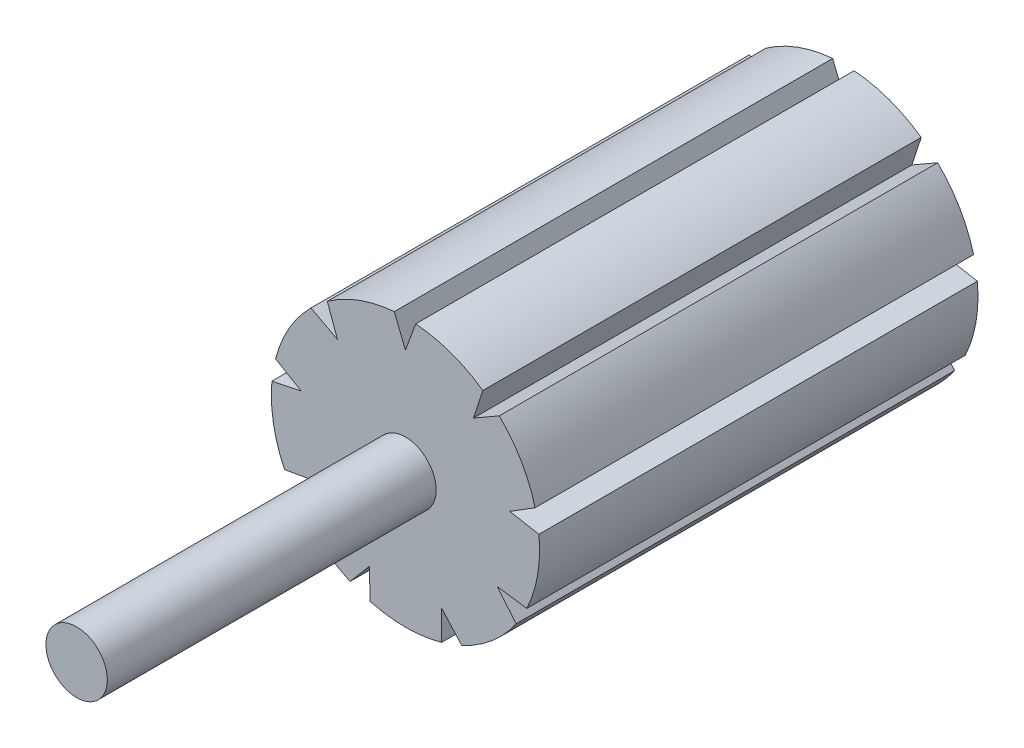
ISO-10303-21;
HEADER;
FILE_DESCRIPTION(('STEP AP214'),'2;1');
FILE_NAME('part.step','',(''),(''),'','','');
FILE_SCHEMA(('AUTOMOTIVE_DESIGN { 1 0 10303 214 1 1 1 1 }'));
ENDSEC;
DATA;
#1=APPLICATION_CONTEXT('core data for automotive mechanical design processes');
#2=APPLICATION_PROTOCOL_DEFINITION('international standard','automotive_design',2000,#1);
#3=PRODUCT_CONTEXT('',#1,'mechanical');
#4=PRODUCT('Part','Part','',(#3));
#5=PRODUCT_RELATED_PRODUCT_CATEGORY('part','',(#4));
#6=PRODUCT_DEFINITION_FORMATION('','',#4);
#7=PRODUCT_DEFINITION_CONTEXT('part definition',#1,'design');
#8=PRODUCT_DEFINITION('design','',#6,#7);
#9=PRODUCT_DEFINITION_SHAPE('','',#8);
#10=(LENGTH_UNIT() NAMED_UNIT(*) SI_UNIT(.MILLI.,.METRE.));
#11=(NAMED_UNIT(*) PLANE_ANGLE_UNIT() SI_UNIT($,.RADIAN.));
#12=(NAMED_UNIT(*) SI_UNIT($,.STERADIAN.) SOLID_ANGLE_UNIT());
#13=UNCERTAINTY_MEASURE_WITH_UNIT(LENGTH_MEASURE(1.E-05),#10,'distance_accuracy_value','');
#14=(GEOMETRIC_REPRESENTATION_CONTEXT(3) GLOBAL_UNCERTAINTY_ASSIGNED_CONTEXT((#13)) GLOBAL_UNIT_ASSIGNED_CONTEXT((#10,
#11,#12)) REPRESENTATION_CONTEXT('',''));
#15=CARTESIAN_POINT('',(0.,0.,0.));
#16=DIRECTION('',(0.,0.,1.));
#17=DIRECTION('',(1.,0.,0.));
#18=AXIS2_PLACEMENT_3D('',#15,#16,#17);
#19=CARTESIAN_POINT('',(-0.510008870233366,6.09753795689209,20.));
#20=DIRECTION('',(-0.928039759605838,-0.372481146624549,0.));
#21=DIRECTION('',(0.372481146624549,-0.928039759605838,0.));
#22=AXIS2_PLACEMENT_3D('',#19,#20,#21);
#23=PLANE('',#22);
#24=DIRECTION('',(-0.372481146624549,0.928039759605838,0.));
#25=VECTOR('',#24,1.);
#26=CARTESIAN_POINT('',(-0.510008870233366,6.09753795689209,0.));
#27=LINE('',#26,#25);
#28=CARTESIAN_POINT('',(0.,4.82684677260722,0.));
#29=VERTEX_POINT('',#28);
#30=CARTESIAN_POINT('',(-0.510008870233366,6.09753795689209,0.));
#31=VERTEX_POINT('',#30);
#32=EDGE_CURVE('E254',#29,#31,#27,.T.);
#33=ORIENTED_EDGE('',*,*,#32,.T.);
#34=DIRECTION('',(0.,0.,-1.));
#35=VECTOR('',#34,1.);
#36=CARTESIAN_POINT('',(-0.510008870233366,6.09753795689209,20.));
#37=LINE('',#36,#35);
#38=CARTESIAN_POINT('',(-0.510008870233366,6.09753795689209,20.));
#39=VERTEX_POINT('',#38);
#40=EDGE_CURVE('E11',#39,#31,#37,.T.);
#41=ORIENTED_EDGE('',*,*,#40,.F.);
#42=DIRECTION('',(-0.372481146624549,0.928039759605838,0.));
#43=VECTOR('',#42,1.);
#44=CARTESIAN_POINT('',(-0.510008870233366,6.09753795689209,20.));
#45=LINE('',#44,#43);
#46=CARTESIAN_POINT('',(0.,4.82684677260722,20.));
#47=VERTEX_POINT('',#46);
#48=EDGE_CURVE('E334',#47,#39,#45,.T.);
#49=ORIENTED_EDGE('',*,*,#48,.F.);
#50=DIRECTION('',(0.,0.,-1.));
#51=VECTOR('',#50,1.);
#52=CARTESIAN_POINT('',(0.,4.82684677260722,20.));
#53=LINE('',#52,#51);
#54=EDGE_CURVE('E250',#47,#29,#53,.T.);
#55=ORIENTED_EDGE('',*,*,#54,.T.);
#56=EDGE_LOOP('',(#33,#41,#49,#55));
#57=FACE_BOUND('',#56,.T.);
#58=ADVANCED_FACE('F39',(#57),#23,.F.);
#59=CARTESIAN_POINT('',(0.,0.,20.));
#60=DIRECTION('',(0.,0.,-1.));
#61=DIRECTION('',(-1.,0.,0.));
#62=AXIS2_PLACEMENT_3D('',#59,#60,#61);
#63=CYLINDRICAL_SURFACE('',#62,6.11882980507355);
#64=CARTESIAN_POINT('',(0.,0.,0.));
#65=DIRECTION('',(0.,0.,1.));
#66=DIRECTION('',(1.,0.,0.));
#67=AXIS2_PLACEMENT_3D('',#64,#65,#66);
#68=CIRCLE('',#67,6.11882980507355);
#69=CARTESIAN_POINT('',(-3.56361986297676,4.97400157374864,0.));
#70=VERTEX_POINT('',#69);
#71=EDGE_CURVE('E258',#31,#70,#68,.T.);
#72=ORIENTED_EDGE('',*,*,#71,.T.);
#73=DIRECTION('',(0.,0.,-1.));
#74=VECTOR('',#73,1.);
#75=CARTESIAN_POINT('',(-3.56361986297676,4.97400157374864,20.));
#76=LINE('',#75,#74);
#77=CARTESIAN_POINT('',(-3.56361986297676,4.97400157374864,20.));
#78=VERTEX_POINT('',#77);
#79=EDGE_CURVE('E48',#78,#70,#76,.T.);
#80=ORIENTED_EDGE('',*,*,#79,.F.);
#81=CARTESIAN_POINT('',(0.,0.,20.));
#82=DIRECTION('',(0.,0.,1.));
#83=DIRECTION('',(1.,0.,0.));
#84=AXIS2_PLACEMENT_3D('',#81,#82,#83);
#85=CIRCLE('',#84,6.11882980507355);
#86=EDGE_CURVE('E156',#39,#78,#85,.T.);
#87=ORIENTED_EDGE('',*,*,#86,.F.);
#88=ORIENTED_EDGE('',*,*,#40,.T.);
#89=EDGE_LOOP('',(#72,#80,#87,#88));
#90=FACE_BOUND('',#89,.T.);
#91=ADVANCED_FACE('F534',(#90),#63,.T.);
#92=CARTESIAN_POINT('',(-3.10263729928743,3.69757914794242,20.));
#93=DIRECTION('',(0.940541601426666,0.33967851858156,0.));
#94=DIRECTION('',(-0.33967851858156,0.940541601426666,0.));
#95=AXIS2_PLACEMENT_3D('',#92,#93,#94);
#96=PLANE('',#95);
#97=DIRECTION('',(0.33967851858156,-0.940541601426666,0.));
#98=VECTOR('',#97,1.);
#99=CARTESIAN_POINT('',(-3.10263729928743,3.69757914794242,0.));
#100=LINE('',#99,#98);
#101=CARTESIAN_POINT('',(-3.10263729928743,3.69757914794242,0.));
#102=VERTEX_POINT('',#101);
#103=EDGE_CURVE('E262',#70,#102,#100,.T.);
#104=ORIENTED_EDGE('',*,*,#103,.T.);
#105=DIRECTION('',(0.,0.,-1.));
#106=VECTOR('',#105,1.);
#107=CARTESIAN_POINT('',(-3.10263729928743,3.69757914794242,20.));
#108=LINE('',#107,#106);
#109=CARTESIAN_POINT('',(-3.10263729928743,3.69757914794242,20.));
#110=VERTEX_POINT('',#109);
#111=EDGE_CURVE('E421',#110,#102,#108,.T.);
#112=ORIENTED_EDGE('',*,*,#111,.F.);
#113=DIRECTION('',(0.33967851858156,-0.940541601426666,0.));
#114=VECTOR('',#113,1.);
#115=CARTESIAN_POINT('',(-3.10263729928743,3.69757914794242,20.));
#116=LINE('',#115,#114);
#117=EDGE_CURVE('E431',#78,#110,#116,.T.);
#118=ORIENTED_EDGE('',*,*,#117,.F.);
#119=ORIENTED_EDGE('',*,*,#79,.T.);
#120=EDGE_LOOP('',(#104,#112,#118,#119));
#121=FACE_BOUND('',#120,.T.);
#122=ADVANCED_FACE('F429',(#121),#96,.F.);
#123=CARTESIAN_POINT('',(-4.31011130926722,4.34315768596786,20.));
#124=DIRECTION('',(-0.47149343494739,-0.881869571309449,0.));
#125=DIRECTION('',(0.881869571309449,-0.47149343494739,0.));
#126=AXIS2_PLACEMENT_3D('',#123,#124,#125);
#127=PLANE('',#126);
#128=DIRECTION('',(-0.881869571309449,0.47149343494739,0.));
#129=VECTOR('',#128,1.);
#130=CARTESIAN_POINT('',(-4.31011130926722,4.34315768596786,0.));
#131=LINE('',#130,#129);
#132=CARTESIAN_POINT('',(-4.31011130926727,4.3431576859679,0.));
#133=VERTEX_POINT('',#132);
#134=EDGE_CURVE('E265',#102,#133,#131,.T.);
#135=ORIENTED_EDGE('',*,*,#134,.T.);
#136=DIRECTION('',(0.,0.,-1.));
#137=VECTOR('',#136,1.);
#138=CARTESIAN_POINT('',(-4.31011130926727,4.3431576859679,20.));
#139=LINE('',#138,#137);
#140=CARTESIAN_POINT('',(-4.31011130926727,4.3431576859679,20.));
#141=VERTEX_POINT('',#140);
#142=EDGE_CURVE('E417',#141,#133,#139,.T.);
#143=ORIENTED_EDGE('',*,*,#142,.F.);
#144=DIRECTION('',(-0.881869571309449,0.47149343494739,0.));
#145=VECTOR('',#144,1.);
#146=CARTESIAN_POINT('',(-4.31011130926722,4.34315768596786,20.));
#147=LINE('',#146,#145);
#148=EDGE_CURVE('E450',#110,#141,#147,.T.);
#149=ORIENTED_EDGE('',*,*,#148,.F.);
#150=ORIENTED_EDGE('',*,*,#111,.T.);
#151=EDGE_LOOP('',(#135,#143,#149,#150));
#152=FACE_BOUND('',#151,.T.);
#153=ADVANCED_FACE('F440',(#152),#127,.F.);
#154=CARTESIAN_POINT('',(0.,0.,20.));
#155=DIRECTION('',(0.,0.,-1.));
#156=DIRECTION('',(-1.,0.,0.));
#157=AXIS2_PLACEMENT_3D('',#154,#155,#156);
#158=CYLINDRICAL_SURFACE('',#157,6.11882980507349);
#159=CARTESIAN_POINT('',(0.,0.,0.));
#160=DIRECTION('',(0.,0.,1.));
#161=DIRECTION('',(1.,0.,0.));
#162=AXIS2_PLACEMENT_3D('',#159,#160,#161);
#163=CIRCLE('',#162,6.11882980507349);
#164=CARTESIAN_POINT('',(-5.92711777558873,1.51965557208089,0.));
#165=VERTEX_POINT('',#164);
#166=EDGE_CURVE('E268',#133,#165,#163,.T.);
#167=ORIENTED_EDGE('',*,*,#166,.T.);
#168=DIRECTION('',(0.,0.,-1.));
#169=VECTOR('',#168,1.);
#170=CARTESIAN_POINT('',(-5.92711777558873,1.51965557208089,20.));
#171=LINE('',#170,#169);
#172=CARTESIAN_POINT('',(-5.92711777558873,1.51965557208089,20.));
#173=VERTEX_POINT('',#172);
#174=EDGE_CURVE('E413',#173,#165,#171,.T.);
#175=ORIENTED_EDGE('',*,*,#174,.F.);
#176=CARTESIAN_POINT('',(0.,0.,20.));
#177=DIRECTION('',(0.,0.,1.));
#178=DIRECTION('',(1.,0.,0.));
#179=AXIS2_PLACEMENT_3D('',#176,#177,#178);
#180=CIRCLE('',#179,6.11882980507349);
#181=EDGE_CURVE('E446',#141,#173,#180,.T.);
#182=ORIENTED_EDGE('',*,*,#181,.F.);
#183=ORIENTED_EDGE('',*,*,#142,.T.);
#184=EDGE_LOOP('',(#167,#175,#182,#183));
#185=FACE_BOUND('',#184,.T.);
#186=ADVANCED_FACE('F444',(#185),#158,.T.);
#187=CARTESIAN_POINT('',(-4.75351612426556,0.838173145940657,20.));
#188=DIRECTION('',(0.502155524274218,0.864777329398086,0.));
#189=DIRECTION('',(-0.864777329398086,0.502155524274218,0.));
#190=AXIS2_PLACEMENT_3D('',#187,#188,#189);
#191=PLANE('',#190);
#192=DIRECTION('',(0.864777329398086,-0.502155524274218,0.));
#193=VECTOR('',#192,1.);
#194=CARTESIAN_POINT('',(-4.75351612426556,0.838173145940657,0.));
#195=LINE('',#194,#193);
#196=CARTESIAN_POINT('',(-4.75351612426556,0.838173145940657,0.));
#197=VERTEX_POINT('',#196);
#198=EDGE_CURVE('E271',#165,#197,#195,.T.);
#199=ORIENTED_EDGE('',*,*,#198,.T.);
#200=DIRECTION('',(0.,0.,-1.));
#201=VECTOR('',#200,1.);
#202=CARTESIAN_POINT('',(-4.75351612426556,0.838173145940657,20.));
#203=LINE('',#202,#201);
#204=CARTESIAN_POINT('',(-4.75351612426556,0.838173145940657,20.));
#205=VERTEX_POINT('',#204);
#206=EDGE_CURVE('E409',#205,#197,#203,.T.);
#207=ORIENTED_EDGE('',*,*,#206,.F.);
#208=DIRECTION('',(0.864777329398086,-0.502155524274218,0.));
#209=VECTOR('',#208,1.);
#210=CARTESIAN_POINT('',(-4.75351612426556,0.838173145940657,20.));
#211=LINE('',#210,#209);
#212=EDGE_CURVE('E449',#173,#205,#211,.T.);
#213=ORIENTED_EDGE('',*,*,#212,.F.);
#214=ORIENTED_EDGE('',*,*,#174,.T.);
#215=EDGE_LOOP('',(#199,#207,#213,#214));
#216=FACE_BOUND('',#215,.T.);
#217=ADVANCED_FACE('F547',(#216),#191,.F.);
#218=CARTESIAN_POINT('',(-6.09346476514355,0.556565664958392,20.));
#219=DIRECTION('',(0.205669907988749,-0.978621422690051,0.));
#220=DIRECTION('',(0.978621422690051,0.205669907988749,0.));
#221=AXIS2_PLACEMENT_3D('',#218,#219,#220);
#222=PLANE('',#221);
#223=DIRECTION('',(-0.978621422690051,-0.205669907988749,0.));
#224=VECTOR('',#223,1.);
#225=CARTESIAN_POINT('',(-6.09346476514355,0.556565664958392,0.));
#226=LINE('',#225,#224);
#227=CARTESIAN_POINT('',(-6.09346476514355,0.556565664958392,0.));
#228=VERTEX_POINT('',#227);
#229=EDGE_CURVE('E274',#197,#228,#226,.T.);
#230=ORIENTED_EDGE('',*,*,#229,.T.);
#231=DIRECTION('',(0.,0.,-1.));
#232=VECTOR('',#231,1.);
#233=CARTESIAN_POINT('',(-6.09346476514355,0.556565664958392,20.));
#234=LINE('',#233,#232);
#235=CARTESIAN_POINT('',(-6.09346476514355,0.556565664958392,20.));
#236=VERTEX_POINT('',#235);
#237=EDGE_CURVE('E405',#236,#228,#234,.T.);
#238=ORIENTED_EDGE('',*,*,#237,.F.);
#239=DIRECTION('',(-0.978621422690051,-0.205669907988749,0.));
#240=VECTOR('',#239,1.);
#241=CARTESIAN_POINT('',(-6.09346476514355,0.556565664958392,20.));
#242=LINE('',#241,#240);
#243=EDGE_CURVE('E454',#205,#236,#242,.T.);
#244=ORIENTED_EDGE('',*,*,#243,.F.);
#245=ORIENTED_EDGE('',*,*,#206,.T.);
#246=EDGE_LOOP('',(#230,#238,#244,#245));
#247=FACE_BOUND('',#246,.T.);
#248=ADVANCED_FACE('F550',(#247),#222,.F.);
#249=CARTESIAN_POINT('',(0.,0.,20.));
#250=DIRECTION('',(0.,0.,-1.));
#251=DIRECTION('',(-1.,0.,0.));
#252=AXIS2_PLACEMENT_3D('',#249,#250,#251);
#253=CYLINDRICAL_SURFACE('',#252,6.11882980507355);
#254=CARTESIAN_POINT('',(0.,0.,0.));
#255=DIRECTION('',(0.,0.,1.));
#256=DIRECTION('',(1.,0.,0.));
#257=AXIS2_PLACEMENT_3D('',#254,#255,#256);
#258=CIRCLE('',#257,6.11882980507355);
#259=CARTESIAN_POINT('',(-5.51725140842617,-2.64575416085393,0.));
#260=VERTEX_POINT('',#259);
#261=EDGE_CURVE('E277',#228,#260,#258,.T.);
#262=ORIENTED_EDGE('',*,*,#261,.T.);
#263=DIRECTION('',(0.,0.,-1.));
#264=VECTOR('',#263,1.);
#265=CARTESIAN_POINT('',(-5.51725140842617,-2.64575416085393,20.));
#266=LINE('',#265,#264);
#267=CARTESIAN_POINT('',(-5.51725140842617,-2.64575416085393,20.));
#268=VERTEX_POINT('',#267);
#269=EDGE_CURVE('E401',#268,#260,#266,.T.);
#270=ORIENTED_EDGE('',*,*,#269,.F.);
#271=CARTESIAN_POINT('',(0.,0.,20.));
#272=DIRECTION('',(0.,0.,1.));
#273=DIRECTION('',(1.,0.,0.));
#274=AXIS2_PLACEMENT_3D('',#271,#272,#273);
#275=CIRCLE('',#274,6.11882980507355);
#276=EDGE_CURVE('E461',#236,#268,#275,.T.);
#277=ORIENTED_EDGE('',*,*,#276,.F.);
#278=ORIENTED_EDGE('',*,*,#237,.T.);
#279=EDGE_LOOP('',(#262,#270,#277,#278));
#280=FACE_BOUND('',#279,.T.);
#281=ADVANCED_FACE('F554',(#280),#253,.T.);
#282=CARTESIAN_POINT('',(-4.18017192525273,-2.41342338630369,20.));
#283=DIRECTION('',(-0.171194703523143,0.985237216859789,0.));
#284=DIRECTION('',(-0.985237216859789,-0.171194703523143,0.));
#285=AXIS2_PLACEMENT_3D('',#282,#283,#284);
#286=PLANE('',#285);
#287=DIRECTION('',(0.985237216859789,0.171194703523143,0.));
#288=VECTOR('',#287,1.);
#289=CARTESIAN_POINT('',(-4.18017192525273,-2.41342338630369,0.));
#290=LINE('',#289,#288);
#291=CARTESIAN_POINT('',(-4.18017192525273,-2.41342338630369,0.));
#292=VERTEX_POINT('',#291);
#293=EDGE_CURVE('E280',#260,#292,#290,.T.);
#294=ORIENTED_EDGE('',*,*,#293,.T.);
#295=DIRECTION('',(0.,0.,-1.));
#296=VECTOR('',#295,1.);
#297=CARTESIAN_POINT('',(-4.18017192525273,-2.41342338630369,20.));
#298=LINE('',#297,#296);
#299=CARTESIAN_POINT('',(-4.18017192525273,-2.41342338630369,20.));
#300=VERTEX_POINT('',#299);
#301=EDGE_CURVE('E397',#300,#292,#298,.T.);
#302=ORIENTED_EDGE('',*,*,#301,.F.);
#303=DIRECTION('',(0.985237216859789,0.171194703523143,0.));
#304=VECTOR('',#303,1.);
#305=CARTESIAN_POINT('',(-4.18017192525273,-2.41342338630369,20.));
#306=LINE('',#305,#304);
#307=EDGE_CURVE('E464',#268,#300,#306,.T.);
#308=ORIENTED_EDGE('',*,*,#307,.F.);
#309=ORIENTED_EDGE('',*,*,#269,.T.);
#310=EDGE_LOOP('',(#294,#302,#308,#309));
#311=FACE_BOUND('',#310,.T.);
#312=ADVANCED_FACE('F558',(#311),#286,.F.);
#313=CARTESIAN_POINT('',(-5.02561833609171,-3.49044961622357,20.));
#314=DIRECTION('',(0.786598015210551,-0.617465434228364,0.));
#315=DIRECTION('',(0.617465434228364,0.786598015210551,0.));
#316=AXIS2_PLACEMENT_3D('',#313,#314,#315);
#317=PLANE('',#316);
#318=DIRECTION('',(-0.617465434228364,-0.786598015210551,0.));
#319=VECTOR('',#318,1.);
#320=CARTESIAN_POINT('',(-5.02561833609171,-3.49044961622357,0.));
#321=LINE('',#320,#319);
#322=CARTESIAN_POINT('',(-5.02561833609171,-3.49044961622357,0.));
#323=VERTEX_POINT('',#322);
#324=EDGE_CURVE('E283',#292,#323,#321,.T.);
#325=ORIENTED_EDGE('',*,*,#324,.T.);
#326=DIRECTION('',(0.,0.,-1.));
#327=VECTOR('',#326,1.);
#328=CARTESIAN_POINT('',(-5.02561833609171,-3.49044961622357,20.));
#329=LINE('',#328,#327);
#330=CARTESIAN_POINT('',(-5.02561833609171,-3.49044961622357,20.));
#331=VERTEX_POINT('',#330);
#332=EDGE_CURVE('E393',#331,#323,#329,.T.);
#333=ORIENTED_EDGE('',*,*,#332,.F.);
#334=DIRECTION('',(-0.617465434228364,-0.786598015210551,0.));
#335=VECTOR('',#334,1.);
#336=CARTESIAN_POINT('',(-5.02561833609171,-3.49044961622357,20.));
#337=LINE('',#336,#335);
#338=EDGE_CURVE('E467',#300,#331,#337,.T.);
#339=ORIENTED_EDGE('',*,*,#338,.F.);
#340=ORIENTED_EDGE('',*,*,#301,.T.);
#341=EDGE_LOOP('',(#325,#333,#339,#340));
#342=FACE_BOUND('',#341,.T.);
#343=ADVANCED_FACE('F562',(#342),#317,.F.);
#344=CARTESIAN_POINT('',(0.,0.,20.));
#345=DIRECTION('',(0.,0.,-1.));
#346=DIRECTION('',(-1.,0.,0.));
#347=AXIS2_PLACEMENT_3D('',#344,#345,#346);
#348=CYLINDRICAL_SURFACE('',#347,6.11882980507355);
#349=CARTESIAN_POINT('',(0.,0.,0.));
#350=DIRECTION('',(0.,0.,1.));
#351=DIRECTION('',(1.,0.,0.));
#352=AXIS2_PLACEMENT_3D('',#349,#350,#351);
#353=CIRCLE('',#352,6.11882980507355);
#354=CARTESIAN_POINT('',(-2.52580178984172,-5.57318611764302,0.));
#355=VERTEX_POINT('',#354);
#356=EDGE_CURVE('E286',#323,#355,#353,.T.);
#357=ORIENTED_EDGE('',*,*,#356,.T.);
#358=DIRECTION('',(0.,0.,-1.));
#359=VECTOR('',#358,1.);
#360=CARTESIAN_POINT('',(-2.52580178984172,-5.57318611764302,20.));
#361=LINE('',#360,#359);
#362=CARTESIAN_POINT('',(-2.52580178984172,-5.57318611764302,20.));
#363=VERTEX_POINT('',#362);
#364=EDGE_CURVE('E389',#363,#355,#361,.T.);
#365=ORIENTED_EDGE('',*,*,#364,.F.);
#366=CARTESIAN_POINT('',(0.,0.,20.));
#367=DIRECTION('',(0.,0.,1.));
#368=DIRECTION('',(1.,0.,0.));
#369=AXIS2_PLACEMENT_3D('',#366,#367,#368);
#370=CIRCLE('',#369,6.11882980507355);
#371=EDGE_CURVE('E470',#331,#363,#370,.T.);
#372=ORIENTED_EDGE('',*,*,#371,.F.);
#373=ORIENTED_EDGE('',*,*,#332,.T.);
#374=EDGE_LOOP('',(#357,#365,#372,#373));
#375=FACE_BOUND('',#374,.T.);
#376=ADVANCED_FACE('F566',(#375),#348,.T.);
#377=CARTESIAN_POINT('',(-1.65087882497808,-4.53575229388331,20.));
#378=DIRECTION('',(-0.764441026924827,0.644693660860812,0.));
#379=DIRECTION('',(-0.644693660860812,-0.764441026924827,0.));
#380=AXIS2_PLACEMENT_3D('',#377,#378,#379);
#381=PLANE('',#380);
#382=DIRECTION('',(0.644693660860812,0.764441026924827,0.));
#383=VECTOR('',#382,1.);
#384=CARTESIAN_POINT('',(-1.65087882497808,-4.53575229388331,0.));
#385=LINE('',#384,#383);
#386=CARTESIAN_POINT('',(-1.65087882497808,-4.53575229388331,0.));
#387=VERTEX_POINT('',#386);
#388=EDGE_CURVE('E289',#355,#387,#385,.T.);
#389=ORIENTED_EDGE('',*,*,#388,.T.);
#390=DIRECTION('',(0.,0.,-1.));
#391=VECTOR('',#390,1.);
#392=CARTESIAN_POINT('',(-1.65087882497808,-4.53575229388331,20.));
#393=LINE('',#392,#391);
#394=CARTESIAN_POINT('',(-1.65087882497808,-4.53575229388331,20.));
#395=VERTEX_POINT('',#394);
#396=EDGE_CURVE('E385',#395,#387,#393,.T.);
#397=ORIENTED_EDGE('',*,*,#396,.F.);
#398=DIRECTION('',(0.644693660860812,0.764441026924827,0.));
#399=VECTOR('',#398,1.);
#400=CARTESIAN_POINT('',(-1.65087882497808,-4.53575229388331,20.));
#401=LINE('',#400,#399);
#402=EDGE_CURVE('E473',#363,#395,#401,.T.);
#403=ORIENTED_EDGE('',*,*,#402,.F.);
#404=ORIENTED_EDGE('',*,*,#364,.T.);
#405=EDGE_LOOP('',(#389,#397,#403,#404));
#406=FACE_BOUND('',#405,.T.);
#407=ADVANCED_FACE('F570',(#406),#381,.F.);
#408=CARTESIAN_POINT('',(-1.60622923405625,-5.90424472994807,20.));
#409=DIRECTION('',(0.999468169052171,0.0326094932726814,0.));
#410=DIRECTION('',(-0.0326094932726814,0.999468169052171,0.));
#411=AXIS2_PLACEMENT_3D('',#408,#409,#410);
#412=PLANE('',#411);
#413=DIRECTION('',(0.0326094932726814,-0.999468169052171,0.));
#414=VECTOR('',#413,1.);
#415=CARTESIAN_POINT('',(-1.60622923405625,-5.90424472994807,0.));
#416=LINE('',#415,#414);
#417=CARTESIAN_POINT('',(-1.60622923405625,-5.90424472994807,0.));
#418=VERTEX_POINT('',#417);
#419=EDGE_CURVE('E292',#387,#418,#416,.T.);
#420=ORIENTED_EDGE('',*,*,#419,.T.);
#421=DIRECTION('',(0.,0.,-1.));
#422=VECTOR('',#421,1.);
#423=CARTESIAN_POINT('',(-1.60622923405625,-5.90424472994807,20.));
#424=LINE('',#423,#422);
#425=CARTESIAN_POINT('',(-1.60622923405625,-5.90424472994807,20.));
#426=VERTEX_POINT('',#425);
#427=EDGE_CURVE('E381',#426,#418,#424,.T.);
#428=ORIENTED_EDGE('',*,*,#427,.F.);
#429=DIRECTION('',(0.0326094932726814,-0.999468169052171,0.));
#430=VECTOR('',#429,1.);
#431=CARTESIAN_POINT('',(-1.60622923405625,-5.90424472994807,20.));
#432=LINE('',#431,#430);
#433=EDGE_CURVE('E476',#395,#426,#432,.T.);
#434=ORIENTED_EDGE('',*,*,#433,.F.);
#435=ORIENTED_EDGE('',*,*,#396,.T.);
#436=EDGE_LOOP('',(#420,#428,#434,#435));
#437=FACE_BOUND('',#436,.T.);
#438=ADVANCED_FACE('F574',(#437),#412,.F.);
#439=CARTESIAN_POINT('',(0.,0.,20.));
#440=DIRECTION('',(0.,0.,-1.));
#441=DIRECTION('',(-1.,0.,0.));
#442=AXIS2_PLACEMENT_3D('',#439,#440,#441);
#443=CYLINDRICAL_SURFACE('',#442,6.11882980507355);
#444=CARTESIAN_POINT('',(0.,0.,0.));
#445=DIRECTION('',(0.,0.,1.));
#446=DIRECTION('',(1.,0.,0.));
#447=AXIS2_PLACEMENT_3D('',#444,#445,#446);
#448=CIRCLE('',#447,6.11882980507355);
#449=CARTESIAN_POINT('',(1.64749855736974,-5.8928623509226,0.));
#450=VERTEX_POINT('',#449);
#451=EDGE_CURVE('E295',#418,#450,#448,.T.);
#452=ORIENTED_EDGE('',*,*,#451,.T.);
#453=DIRECTION('',(0.,0.,-1.));
#454=VECTOR('',#453,1.);
#455=CARTESIAN_POINT('',(1.64749855736974,-5.8928623509226,20.));
#456=LINE('',#455,#454);
#457=CARTESIAN_POINT('',(1.64749855736974,-5.8928623509226,20.));
#458=VERTEX_POINT('',#457);
#459=EDGE_CURVE('E377',#458,#450,#456,.T.);
#460=ORIENTED_EDGE('',*,*,#459,.F.);
#461=CARTESIAN_POINT('',(0.,0.,20.));
#462=DIRECTION('',(0.,0.,1.));
#463=DIRECTION('',(1.,0.,0.));
#464=AXIS2_PLACEMENT_3D('',#461,#462,#463);
#465=CIRCLE('',#464,6.11882980507355);
#466=EDGE_CURVE('E479',#426,#458,#465,.T.);
#467=ORIENTED_EDGE('',*,*,#466,.F.);
#468=ORIENTED_EDGE('',*,*,#427,.T.);
#469=EDGE_LOOP('',(#452,#460,#467,#468));
#470=FACE_BOUND('',#469,.T.);
#471=ADVANCED_FACE('F578',(#470),#443,.T.);
#472=CARTESIAN_POINT('',(1.65087882497825,-4.53575229388325,20.));
#473=DIRECTION('',(-0.999996898012715,0.00249077597312308,0.));
#474=DIRECTION('',(-0.00249077597312308,-0.999996898012715,0.));
#475=AXIS2_PLACEMENT_3D('',#472,#473,#474);
#476=PLANE('',#475);
#477=DIRECTION('',(0.00249077597312308,0.999996898012715,0.));
#478=VECTOR('',#477,1.);
#479=CARTESIAN_POINT('',(1.65087882497825,-4.53575229388325,0.));
#480=LINE('',#479,#478);
#481=CARTESIAN_POINT('',(1.65087882497825,-4.53575229388325,0.));
#482=VERTEX_POINT('',#481);
#483=EDGE_CURVE('E298',#450,#482,#480,.T.);
#484=ORIENTED_EDGE('',*,*,#483,.T.);
#485=DIRECTION('',(0.,0.,-1.));
#486=VECTOR('',#485,1.);
#487=CARTESIAN_POINT('',(1.65087882497825,-4.53575229388325,20.));
#488=LINE('',#487,#486);
#489=CARTESIAN_POINT('',(1.65087882497825,-4.53575229388325,20.));
#490=VERTEX_POINT('',#489);
#491=EDGE_CURVE('E373',#490,#482,#488,.T.);
#492=ORIENTED_EDGE('',*,*,#491,.F.);
#493=DIRECTION('',(0.00249077597312308,0.999996898012715,0.));
#494=VECTOR('',#493,1.);
#495=CARTESIAN_POINT('',(1.65087882497825,-4.53575229388325,20.));
#496=LINE('',#495,#494);
#497=EDGE_CURVE('E482',#458,#490,#496,.T.);
#498=ORIENTED_EDGE('',*,*,#497,.F.);
#499=ORIENTED_EDGE('',*,*,#459,.T.);
#500=EDGE_LOOP('',(#484,#492,#498,#499));
#501=FACE_BOUND('',#500,.T.);
#502=ADVANCED_FACE('F582',(#501),#476,.F.);
#503=CARTESIAN_POINT('',(2.56473237784363,-5.55537811615889,20.));
#504=DIRECTION('',(0.744676058742879,0.66742607645729,0.));
#505=DIRECTION('',(-0.66742607645729,0.744676058742879,0.));
#506=AXIS2_PLACEMENT_3D('',#503,#504,#505);
#507=PLANE('',#506);
#508=DIRECTION('',(0.66742607645729,-0.744676058742879,0.));
#509=VECTOR('',#508,1.);
#510=CARTESIAN_POINT('',(2.56473237784363,-5.55537811615889,0.));
#511=LINE('',#510,#509);
#512=CARTESIAN_POINT('',(2.56473237784362,-5.55537811615889,0.));
#513=VERTEX_POINT('',#512);
#514=EDGE_CURVE('E301',#482,#513,#511,.T.);
#515=ORIENTED_EDGE('',*,*,#514,.T.);
#516=DIRECTION('',(0.,0.,-1.));
#517=VECTOR('',#516,1.);
#518=CARTESIAN_POINT('',(2.56473237784362,-5.55537811615889,20.));
#519=LINE('',#518,#517);
#520=CARTESIAN_POINT('',(2.56473237784362,-5.55537811615889,20.));
#521=VERTEX_POINT('',#520);
#522=EDGE_CURVE('E369',#521,#513,#519,.T.);
#523=ORIENTED_EDGE('',*,*,#522,.F.);
#524=DIRECTION('',(0.66742607645729,-0.744676058742879,0.));
#525=VECTOR('',#524,1.);
#526=CARTESIAN_POINT('',(2.56473237784363,-5.55537811615889,20.));
#527=LINE('',#526,#525);
#528=EDGE_CURVE('E485',#490,#521,#527,.T.);
#529=ORIENTED_EDGE('',*,*,#528,.F.);
#530=ORIENTED_EDGE('',*,*,#491,.T.);
#531=EDGE_LOOP('',(#515,#523,#529,#530));
#532=FACE_BOUND('',#531,.T.);
#533=ADVANCED_FACE('F586',(#532),#507,.F.);
#534=CARTESIAN_POINT('',(0.,0.,20.));
#535=DIRECTION('',(0.,0.,-1.));
#536=DIRECTION('',(-1.,0.,0.));
#537=AXIS2_PLACEMENT_3D('',#534,#535,#536);
#538=CYLINDRICAL_SURFACE('',#537,6.11882980507355);
#539=CARTESIAN_POINT('',(0.,0.,0.));
#540=DIRECTION('',(0.,0.,1.));
#541=DIRECTION('',(1.,0.,0.));
#542=AXIS2_PLACEMENT_3D('',#539,#540,#541);
#543=CIRCLE('',#542,6.11882980507355);
#544=CARTESIAN_POINT('',(5.04991601968097,-3.45520279833558,0.));
#545=VERTEX_POINT('',#544);
#546=EDGE_CURVE('E304',#513,#545,#543,.T.);
#547=ORIENTED_EDGE('',*,*,#546,.T.);
#548=DIRECTION('',(0.,0.,-1.));
#549=VECTOR('',#548,1.);
#550=CARTESIAN_POINT('',(5.04991601968097,-3.45520279833558,20.));
#551=LINE('',#550,#549);
#552=CARTESIAN_POINT('',(5.04991601968097,-3.45520279833558,20.));
#553=VERTEX_POINT('',#552);
#554=EDGE_CURVE('E365',#553,#545,#551,.T.);
#555=ORIENTED_EDGE('',*,*,#554,.F.);
#556=CARTESIAN_POINT('',(0.,0.,20.));
#557=DIRECTION('',(0.,0.,1.));
#558=DIRECTION('',(1.,0.,0.));
#559=AXIS2_PLACEMENT_3D('',#556,#557,#558);
#560=CIRCLE('',#559,6.11882980507355);
#561=EDGE_CURVE('E488',#521,#553,#560,.T.);
#562=ORIENTED_EDGE('',*,*,#561,.F.);
#563=ORIENTED_EDGE('',*,*,#522,.T.);
#564=EDGE_LOOP('',(#547,#555,#562,#563));
#565=FACE_BOUND('',#564,.T.);
#566=ADVANCED_FACE('F590',(#565),#538,.T.);
#567=CARTESIAN_POINT('',(4.18017192525283,-2.41342338630353,20.));
#568=DIRECTION('',(-0.767643106792884,-0.640877570674282,0.));
#569=DIRECTION('',(0.640877570674282,-0.767643106792884,0.));
#570=AXIS2_PLACEMENT_3D('',#567,#568,#569);
#571=PLANE('',#570);
#572=DIRECTION('',(-0.640877570674282,0.767643106792884,0.));
#573=VECTOR('',#572,1.);
#574=CARTESIAN_POINT('',(4.18017192525283,-2.41342338630353,0.));
#575=LINE('',#574,#573);
#576=CARTESIAN_POINT('',(4.18017192525283,-2.41342338630353,0.));
#577=VERTEX_POINT('',#576);
#578=EDGE_CURVE('E307',#545,#577,#575,.T.);
#579=ORIENTED_EDGE('',*,*,#578,.T.);
#580=DIRECTION('',(0.,0.,-1.));
#581=VECTOR('',#580,1.);
#582=CARTESIAN_POINT('',(4.18017192525283,-2.41342338630353,20.));
#583=LINE('',#582,#581);
#584=CARTESIAN_POINT('',(4.18017192525283,-2.41342338630353,20.));
#585=VERTEX_POINT('',#584);
#586=EDGE_CURVE('E361',#585,#577,#583,.T.);
#587=ORIENTED_EDGE('',*,*,#586,.F.);
#588=DIRECTION('',(-0.640877570674282,0.767643106792884,0.));
#589=VECTOR('',#588,1.);
#590=CARTESIAN_POINT('',(4.18017192525283,-2.41342338630353,20.));
#591=LINE('',#590,#589);
#592=EDGE_CURVE('E491',#553,#585,#591,.T.);
#593=ORIENTED_EDGE('',*,*,#592,.F.);
#594=ORIENTED_EDGE('',*,*,#554,.T.);
#595=EDGE_LOOP('',(#579,#587,#593,#594));
#596=FACE_BOUND('',#595,.T.);
#597=ADVANCED_FACE('F594',(#596),#571,.F.);
#598=CARTESIAN_POINT('',(5.53562720632511,-2.60708834066851,20.));
#599=DIRECTION('',(0.141441744395277,0.989946580852937,0.));
#600=DIRECTION('',(-0.989946580852937,0.141441744395277,0.));
#601=AXIS2_PLACEMENT_3D('',#598,#599,#600);
#602=PLANE('',#601);
#603=DIRECTION('',(0.989946580852937,-0.141441744395277,0.));
#604=VECTOR('',#603,1.);
#605=CARTESIAN_POINT('',(5.53562720632511,-2.60708834066851,0.));
#606=LINE('',#605,#604);
#607=CARTESIAN_POINT('',(5.53562720632511,-2.60708834066851,0.));
#608=VERTEX_POINT('',#607);
#609=EDGE_CURVE('E310',#577,#608,#606,.T.);
#610=ORIENTED_EDGE('',*,*,#609,.T.);
#611=DIRECTION('',(0.,0.,-1.));
#612=VECTOR('',#611,1.);
#613=CARTESIAN_POINT('',(5.53562720632511,-2.60708834066851,20.));
#614=LINE('',#613,#612);
#615=CARTESIAN_POINT('',(5.53562720632511,-2.60708834066851,20.));
#616=VERTEX_POINT('',#615);
#617=EDGE_CURVE('E357',#616,#608,#614,.T.);
#618=ORIENTED_EDGE('',*,*,#617,.F.);
#619=DIRECTION('',(0.989946580852937,-0.141441744395277,0.));
#620=VECTOR('',#619,1.);
#621=CARTESIAN_POINT('',(5.53562720632511,-2.60708834066851,20.));
#622=LINE('',#621,#620);
#623=EDGE_CURVE('E494',#585,#616,#622,.T.);
#624=ORIENTED_EDGE('',*,*,#623,.F.);
#625=ORIENTED_EDGE('',*,*,#586,.T.);
#626=EDGE_LOOP('',(#610,#618,#624,#625));
#627=FACE_BOUND('',#626,.T.);
#628=ADVANCED_FACE('F598',(#627),#602,.F.);
#629=CARTESIAN_POINT('',(0.,0.,20.));
#630=DIRECTION('',(0.,0.,-1.));
#631=DIRECTION('',(-1.,0.,0.));
#632=AXIS2_PLACEMENT_3D('',#629,#630,#631);
#633=CYLINDRICAL_SURFACE('',#632,6.11882980507355);
#634=CARTESIAN_POINT('',(0.,0.,0.));
#635=DIRECTION('',(0.,0.,1.));
#636=DIRECTION('',(1.,0.,0.));
#637=AXIS2_PLACEMENT_3D('',#634,#635,#636);
#638=CIRCLE('',#637,6.11882980507355);
#639=CARTESIAN_POINT('',(6.08942165281848,0.599184543894378,0.));
#640=VERTEX_POINT('',#639);
#641=EDGE_CURVE('E313',#608,#640,#638,.T.);
#642=ORIENTED_EDGE('',*,*,#641,.T.);
#643=DIRECTION('',(0.,0.,-1.));
#644=VECTOR('',#643,1.);
#645=CARTESIAN_POINT('',(6.08942165281848,0.599184543894378,20.));
#646=LINE('',#645,#644);
#647=CARTESIAN_POINT('',(6.08942165281848,0.599184543894378,20.));
#648=VERTEX_POINT('',#647);
#649=EDGE_CURVE('E353',#648,#640,#646,.T.);
#650=ORIENTED_EDGE('',*,*,#649,.F.);
#651=CARTESIAN_POINT('',(0.,0.,20.));
#652=DIRECTION('',(0.,0.,1.));
#653=DIRECTION('',(1.,0.,0.));
#654=AXIS2_PLACEMENT_3D('',#651,#652,#653);
#655=CIRCLE('',#654,6.11882980507355);
#656=EDGE_CURVE('E497',#616,#648,#655,.T.);
#657=ORIENTED_EDGE('',*,*,#656,.F.);
#658=ORIENTED_EDGE('',*,*,#617,.T.);
#659=EDGE_LOOP('',(#642,#650,#657,#658));
#660=FACE_BOUND('',#659,.T.);
#661=ADVANCED_FACE('F602',(#660),#633,.T.);
#662=CARTESIAN_POINT('',(4.75351612426553,0.838173145940837,20.));
#663=DIRECTION('',(-0.176100574501839,-0.98437217944237,0.));
#664=DIRECTION('',(0.98437217944237,-0.176100574501839,0.));
#665=AXIS2_PLACEMENT_3D('',#662,#663,#664);
#666=PLANE('',#665);
#667=DIRECTION('',(-0.98437217944237,0.176100574501839,0.));
#668=VECTOR('',#667,1.);
#669=CARTESIAN_POINT('',(4.75351612426553,0.838173145940837,0.));
#670=LINE('',#669,#668);
#671=CARTESIAN_POINT('',(4.75351612426553,0.838173145940837,0.));
#672=VERTEX_POINT('',#671);
#673=EDGE_CURVE('E316',#640,#672,#670,.T.);
#674=ORIENTED_EDGE('',*,*,#673,.T.);
#675=DIRECTION('',(0.,0.,-1.));
#676=VECTOR('',#675,1.);
#677=CARTESIAN_POINT('',(4.75351612426553,0.838173145940837,20.));
#678=LINE('',#677,#676);
#679=CARTESIAN_POINT('',(4.75351612426553,0.838173145940837,20.));
#680=VERTEX_POINT('',#679);
#681=EDGE_CURVE('E349',#680,#672,#678,.T.);
#682=ORIENTED_EDGE('',*,*,#681,.F.);
#683=DIRECTION('',(-0.98437217944237,0.176100574501839,0.));
#684=VECTOR('',#683,1.);
#685=CARTESIAN_POINT('',(4.75351612426553,0.838173145940837,20.));
#686=LINE('',#685,#684);
#687=EDGE_CURVE('E500',#648,#680,#686,.T.);
#688=ORIENTED_EDGE('',*,*,#687,.F.);
#689=ORIENTED_EDGE('',*,*,#649,.T.);
#690=EDGE_LOOP('',(#674,#682,#688,#689));
#691=FACE_BOUND('',#690,.T.);
#692=ADVANCED_FACE('F606',(#691),#666,.F.);
#693=CARTESIAN_POINT('',(5.91634054332354,1.5610870439801,20.));
#694=DIRECTION('',(-0.527974734104765,0.84926007803676,0.));
#695=DIRECTION('',(-0.849260078036759,-0.527974734104765,0.));
#696=AXIS2_PLACEMENT_3D('',#693,#694,#695);
#697=PLANE('',#696);
#698=DIRECTION('',(0.849260078036759,0.527974734104765,0.));
#699=VECTOR('',#698,1.);
#700=CARTESIAN_POINT('',(5.91634054332354,1.5610870439801,0.));
#701=LINE('',#700,#699);
#702=CARTESIAN_POINT('',(5.9163405433236,1.56108704398012,0.));
#703=VERTEX_POINT('',#702);
#704=EDGE_CURVE('E319',#672,#703,#701,.T.);
#705=ORIENTED_EDGE('',*,*,#704,.T.);
#706=DIRECTION('',(0.,0.,-1.));
#707=VECTOR('',#706,1.);
#708=CARTESIAN_POINT('',(5.9163405433236,1.56108704398012,20.));
#709=LINE('',#708,#707);
#710=CARTESIAN_POINT('',(5.9163405433236,1.56108704398012,20.));
#711=VERTEX_POINT('',#710);
#712=EDGE_CURVE('E345',#711,#703,#709,.T.);
#713=ORIENTED_EDGE('',*,*,#712,.F.);
#714=DIRECTION('',(0.849260078036759,0.527974734104765,0.));
#715=VECTOR('',#714,1.);
#716=CARTESIAN_POINT('',(5.91634054332354,1.5610870439801,20.));
#717=LINE('',#716,#715);
#718=EDGE_CURVE('E503',#680,#711,#717,.T.);
#719=ORIENTED_EDGE('',*,*,#718,.F.);
#720=ORIENTED_EDGE('',*,*,#681,.T.);
#721=EDGE_LOOP('',(#705,#713,#719,#720));
#722=FACE_BOUND('',#721,.T.);
#723=ADVANCED_FACE('F610',(#722),#697,.F.);
#724=CARTESIAN_POINT('',(0.,0.,20.));
#725=DIRECTION('',(0.,0.,-1.));
#726=DIRECTION('',(-1.,0.,0.));
#727=AXIS2_PLACEMENT_3D('',#724,#725,#726);
#728=CYLINDRICAL_SURFACE('',#727,6.11882980507362);
#729=CARTESIAN_POINT('',(0.,0.,0.));
#730=DIRECTION('',(0.,0.,1.));
#731=DIRECTION('',(1.,0.,0.));
#732=AXIS2_PLACEMENT_3D('',#729,#730,#731);
#733=CIRCLE('',#732,6.11882980507362);
#734=CARTESIAN_POINT('',(4.27961921821907,4.37320677884181,0.));
#735=VERTEX_POINT('',#734);
#736=EDGE_CURVE('E322',#703,#735,#733,.T.);
#737=ORIENTED_EDGE('',*,*,#736,.T.);
#738=DIRECTION('',(0.,0.,-1.));
#739=VECTOR('',#738,1.);
#740=CARTESIAN_POINT('',(4.27961921821907,4.37320677884181,20.));
#741=LINE('',#740,#739);
#742=CARTESIAN_POINT('',(4.27961921821907,4.37320677884181,20.));
#743=VERTEX_POINT('',#742);
#744=EDGE_CURVE('E341',#743,#735,#741,.T.);
#745=ORIENTED_EDGE('',*,*,#744,.F.);
#746=CARTESIAN_POINT('',(0.,0.,20.));
#747=DIRECTION('',(0.,0.,1.));
#748=DIRECTION('',(1.,0.,0.));
#749=AXIS2_PLACEMENT_3D('',#746,#747,#748);
#750=CIRCLE('',#749,6.11882980507362);
#751=EDGE_CURVE('E506',#711,#743,#750,.T.);
#752=ORIENTED_EDGE('',*,*,#751,.F.);
#753=ORIENTED_EDGE('',*,*,#712,.T.);
#754=EDGE_LOOP('',(#737,#745,#752,#753));
#755=FACE_BOUND('',#754,.T.);
#756=ADVANCED_FACE('F514',(#755),#728,.T.);
#757=CARTESIAN_POINT('',(3.10263729928727,3.69757914794258,20.));
#758=DIRECTION('',(0.49784137373852,-0.867268105371196,0.));
#759=DIRECTION('',(0.867268105371196,0.49784137373852,0.));
#760=AXIS2_PLACEMENT_3D('',#757,#758,#759);
#761=PLANE('',#760);
#762=DIRECTION('',(-0.867268105371196,-0.49784137373852,0.));
#763=VECTOR('',#762,1.);
#764=CARTESIAN_POINT('',(3.10263729928727,3.69757914794258,0.));
#765=LINE('',#764,#763);
#766=CARTESIAN_POINT('',(3.10263729928727,3.69757914794258,0.));
#767=VERTEX_POINT('',#766);
#768=EDGE_CURVE('E325',#735,#767,#765,.T.);
#769=ORIENTED_EDGE('',*,*,#768,.T.);
#770=DIRECTION('',(0.,0.,-1.));
#771=VECTOR('',#770,1.);
#772=CARTESIAN_POINT('',(3.10263729928727,3.69757914794258,20.));
#773=LINE('',#772,#771);
#774=CARTESIAN_POINT('',(3.10263729928727,3.69757914794258,20.));
#775=VERTEX_POINT('',#774);
#776=EDGE_CURVE('E243',#775,#767,#773,.T.);
#777=ORIENTED_EDGE('',*,*,#776,.F.);
#778=DIRECTION('',(-0.867268105371196,-0.49784137373852,0.));
#779=VECTOR('',#778,1.);
#780=CARTESIAN_POINT('',(3.10263729928727,3.69757914794258,20.));
#781=LINE('',#780,#779);
#782=EDGE_CURVE('E232',#743,#775,#781,.T.);
#783=ORIENTED_EDGE('',*,*,#782,.F.);
#784=ORIENTED_EDGE('',*,*,#744,.T.);
#785=EDGE_LOOP('',(#769,#777,#783,#784));
#786=FACE_BOUND('',#785,.T.);
#787=ADVANCED_FACE('F518',(#786),#761,.F.);
#788=CARTESIAN_POINT('',(3.52873238729992,4.99881245120049,20.));
#789=DIRECTION('',(-0.95034596673162,0.311195346232786,0.));
#790=DIRECTION('',(-0.311195346232786,-0.95034596673162,0.));
#791=AXIS2_PLACEMENT_3D('',#788,#789,#790);
#792=PLANE('',#791);
#793=DIRECTION('',(0.311195346232786,0.95034596673162,0.));
#794=VECTOR('',#793,1.);
#795=CARTESIAN_POINT('',(3.52873238729992,4.99881245120049,0.));
#796=LINE('',#795,#794);
#797=CARTESIAN_POINT('',(3.52873238729992,4.99881245120049,0.));
#798=VERTEX_POINT('',#797);
#799=EDGE_CURVE('E241',#767,#798,#796,.T.);
#800=ORIENTED_EDGE('',*,*,#799,.T.);
#801=DIRECTION('',(0.,0.,-1.));
#802=VECTOR('',#801,1.);
#803=CARTESIAN_POINT('',(3.52873238729992,4.99881245120049,20.));
#804=LINE('',#803,#802);
#805=CARTESIAN_POINT('',(3.52873238729992,4.99881245120049,20.));
#806=VERTEX_POINT('',#805);
#807=EDGE_CURVE('E238',#806,#798,#804,.T.);
#808=ORIENTED_EDGE('',*,*,#807,.F.);
#809=DIRECTION('',(0.311195346232786,0.95034596673162,0.));
#810=VECTOR('',#809,1.);
#811=CARTESIAN_POINT('',(3.52873238729992,4.99881245120049,20.));
#812=LINE('',#811,#810);
#813=EDGE_CURVE('E226',#775,#806,#812,.T.);
#814=ORIENTED_EDGE('',*,*,#813,.F.);
#815=ORIENTED_EDGE('',*,*,#776,.T.);
#816=EDGE_LOOP('',(#800,#808,#814,#815));
#817=FACE_BOUND('',#816,.T.);
#818=ADVANCED_FACE('F239',(#817),#792,.F.);
#819=CARTESIAN_POINT('',(0.,0.,20.));
#820=DIRECTION('',(0.,0.,-1.));
#821=DIRECTION('',(-1.,0.,0.));
#822=AXIS2_PLACEMENT_3D('',#819,#820,#821);
#823=CYLINDRICAL_SURFACE('',#822,6.11882980507355);
#824=CARTESIAN_POINT('',(0.,0.,0.));
#825=DIRECTION('',(0.,0.,1.));
#826=DIRECTION('',(1.,0.,0.));
#827=AXIS2_PLACEMENT_3D('',#824,#825,#826);
#828=CIRCLE('',#827,6.11882980507355);
#829=CARTESIAN_POINT('',(0.467335388745209,6.1009569591895,0.));
#830=VERTEX_POINT('',#829);
#831=EDGE_CURVE('E142',#798,#830,#828,.T.);
#832=ORIENTED_EDGE('',*,*,#831,.T.);
#833=DIRECTION('',(0.,0.,-1.));
#834=VECTOR('',#833,1.);
#835=CARTESIAN_POINT('',(0.467335388745209,6.1009569591895,20.));
#836=LINE('',#835,#834);
#837=CARTESIAN_POINT('',(0.467335388745209,6.1009569591895,20.));
#838=VERTEX_POINT('',#837);
#839=EDGE_CURVE('E244',#838,#830,#836,.T.);
#840=ORIENTED_EDGE('',*,*,#839,.F.);
#841=CARTESIAN_POINT('',(0.,0.,20.));
#842=DIRECTION('',(0.,0.,1.));
#843=DIRECTION('',(1.,0.,0.));
#844=AXIS2_PLACEMENT_3D('',#841,#842,#843);
#845=CIRCLE('',#844,6.11882980507355);
#846=EDGE_CURVE('E230',#806,#838,#845,.T.);
#847=ORIENTED_EDGE('',*,*,#846,.F.);
#848=ORIENTED_EDGE('',*,*,#807,.T.);
#849=EDGE_LOOP('',(#832,#840,#847,#848));
#850=FACE_BOUND('',#849,.T.);
#851=ADVANCED_FACE('F246',(#850),#823,.T.);
#852=CARTESIAN_POINT('',(0.,4.82684677260722,20.));
#853=DIRECTION('',(0.938837810316027,-0.344359646185508,0.));
#854=DIRECTION('',(0.344359646185508,0.938837810316027,0.));
#855=AXIS2_PLACEMENT_3D('',#852,#853,#854);
#856=PLANE('',#855);
#857=DIRECTION('',(-0.344359646185508,-0.938837810316027,0.));
#858=VECTOR('',#857,1.);
#859=CARTESIAN_POINT('',(0.,4.82684677260722,0.));
#860=LINE('',#859,#858);
#861=EDGE_CURVE('E148',#830,#29,#860,.T.);
#862=ORIENTED_EDGE('',*,*,#861,.T.);
#863=ORIENTED_EDGE('',*,*,#54,.F.);
#864=DIRECTION('',(-0.344359646185508,-0.938837810316027,0.));
#865=VECTOR('',#864,1.);
#866=CARTESIAN_POINT('',(0.,4.82684677260722,20.));
#867=LINE('',#866,#865);
#868=EDGE_CURVE('E56',#838,#47,#867,.T.);
#869=ORIENTED_EDGE('',*,*,#868,.F.);
#870=ORIENTED_EDGE('',*,*,#839,.T.);
#871=EDGE_LOOP('',(#862,#863,#869,#870));
#872=FACE_BOUND('',#871,.T.);
#873=ADVANCED_FACE('F522',(#872),#856,.F.);
#874=CARTESIAN_POINT('',(0.,0.,20.));
#875=DIRECTION('',(0.,0.,1.));
#876=DIRECTION('',(1.,0.,0.));
#877=AXIS2_PLACEMENT_3D('',#874,#875,#876);
#878=PLANE('',#877);
#879=CARTESIAN_POINT('',(0.,0.,20.));
#880=DIRECTION('',(0.,0.,1.));
#881=DIRECTION('',(1.,0.,0.));
#882=AXIS2_PLACEMENT_3D('',#879,#880,#881);
#883=CIRCLE('',#882,1.40028172126);
#884=CARTESIAN_POINT('',(1.40028172126,0.,20.));
#885=VERTEX_POINT('',#884);
#886=EDGE_CURVE('E672',#885,#885,#883,.T.);
#887=ORIENTED_EDGE('',*,*,#886,.F.);
#888=EDGE_LOOP('',(#887));
#889=FACE_BOUND('',#888,.T.);
#890=ORIENTED_EDGE('',*,*,#48,.T.);
#891=ORIENTED_EDGE('',*,*,#86,.T.);
#892=ORIENTED_EDGE('',*,*,#117,.T.);
#893=ORIENTED_EDGE('',*,*,#148,.T.);
#894=ORIENTED_EDGE('',*,*,#181,.T.);
#895=ORIENTED_EDGE('',*,*,#212,.T.);
#896=ORIENTED_EDGE('',*,*,#243,.T.);
#897=ORIENTED_EDGE('',*,*,#276,.T.);
#898=ORIENTED_EDGE('',*,*,#307,.T.);
#899=ORIENTED_EDGE('',*,*,#338,.T.);
#900=ORIENTED_EDGE('',*,*,#371,.T.);
#901=ORIENTED_EDGE('',*,*,#402,.T.);
#902=ORIENTED_EDGE('',*,*,#433,.T.);
#903=ORIENTED_EDGE('',*,*,#466,.T.);
#904=ORIENTED_EDGE('',*,*,#497,.T.);
#905=ORIENTED_EDGE('',*,*,#528,.T.);
#906=ORIENTED_EDGE('',*,*,#561,.T.);
#907=ORIENTED_EDGE('',*,*,#592,.T.);
#908=ORIENTED_EDGE('',*,*,#623,.T.);
#909=ORIENTED_EDGE('',*,*,#656,.T.);
#910=ORIENTED_EDGE('',*,*,#687,.T.);
#911=ORIENTED_EDGE('',*,*,#718,.T.);
#912=ORIENTED_EDGE('',*,*,#751,.T.);
#913=ORIENTED_EDGE('',*,*,#782,.T.);
#914=ORIENTED_EDGE('',*,*,#813,.T.);
#915=ORIENTED_EDGE('',*,*,#846,.T.);
#916=ORIENTED_EDGE('',*,*,#868,.T.);
#917=EDGE_LOOP('',(#890,#891,#892,#893,#894,#895,#896,#897,#898,#899,#900,#901,#902,#903,#904,
#905,#906,#907,#908,#909,#910,#911,#912,#913,#914,#915,#916));
#918=FACE_BOUND('',#917,.T.);
#919=ADVANCED_FACE('F228',(#889,#918),#878,.T.);
#920=CARTESIAN_POINT('',(0.,0.,0.));
#921=DIRECTION('',(0.,0.,1.));
#922=DIRECTION('',(1.,0.,0.));
#923=AXIS2_PLACEMENT_3D('',#920,#921,#922);
#924=PLANE('',#923);
#925=ORIENTED_EDGE('',*,*,#32,.F.);
#926=ORIENTED_EDGE('',*,*,#861,.F.);
#927=ORIENTED_EDGE('',*,*,#831,.F.);
#928=ORIENTED_EDGE('',*,*,#799,.F.);
#929=ORIENTED_EDGE('',*,*,#768,.F.);
#930=ORIENTED_EDGE('',*,*,#736,.F.);
#931=ORIENTED_EDGE('',*,*,#704,.F.);
#932=ORIENTED_EDGE('',*,*,#673,.F.);
#933=ORIENTED_EDGE('',*,*,#641,.F.);
#934=ORIENTED_EDGE('',*,*,#609,.F.);
#935=ORIENTED_EDGE('',*,*,#578,.F.);
#936=ORIENTED_EDGE('',*,*,#546,.F.);
#937=ORIENTED_EDGE('',*,*,#514,.F.);
#938=ORIENTED_EDGE('',*,*,#483,.F.);
#939=ORIENTED_EDGE('',*,*,#451,.F.);
#940=ORIENTED_EDGE('',*,*,#419,.F.);
#941=ORIENTED_EDGE('',*,*,#388,.F.);
#942=ORIENTED_EDGE('',*,*,#356,.F.);
#943=ORIENTED_EDGE('',*,*,#324,.F.);
#944=ORIENTED_EDGE('',*,*,#293,.F.);
#945=ORIENTED_EDGE('',*,*,#261,.F.);
#946=ORIENTED_EDGE('',*,*,#229,.F.);
#947=ORIENTED_EDGE('',*,*,#198,.F.);
#948=ORIENTED_EDGE('',*,*,#166,.F.);
#949=ORIENTED_EDGE('',*,*,#134,.F.);
#950=ORIENTED_EDGE('',*,*,#103,.F.);
#951=ORIENTED_EDGE('',*,*,#71,.F.);
#952=EDGE_LOOP('',(#925,#926,#927,#928,#929,#930,#931,#932,#933,#934,#935,#936,#937,#938,#939,
#940,#941,#942,#943,#944,#945,#946,#947,#948,#949,#950,#951));
#953=FACE_BOUND('',#952,.T.);
#954=ADVANCED_FACE('F435',(#953),#924,.F.);
#955=CARTESIAN_POINT('',(0.,0.,35.));
#956=DIRECTION('',(0.,0.,-1.));
#957=DIRECTION('',(-1.,0.,0.));
#958=AXIS2_PLACEMENT_3D('',#955,#956,#957);
#959=CYLINDRICAL_SURFACE('',#958,1.40028172126);
#960=CARTESIAN_POINT('',(0.,0.,35.));
#961=DIRECTION('',(0.,0.,1.));
#962=DIRECTION('',(1.,0.,0.));
#963=AXIS2_PLACEMENT_3D('',#960,#961,#962);
#964=CIRCLE('',#963,1.40028172126);
#965=CARTESIAN_POINT('',(1.40028172126,0.,35.));
#966=VERTEX_POINT('',#965);
#967=EDGE_CURVE('E259',#966,#966,#964,.T.);
#968=ORIENTED_EDGE('',*,*,#967,.F.);
#969=EDGE_LOOP('',(#968));
#970=FACE_BOUND('',#969,.T.);
#971=ORIENTED_EDGE('',*,*,#886,.T.);
#972=EDGE_LOOP('',(#971));
#973=FACE_BOUND('',#972,.T.);
#974=ADVANCED_FACE('F642',(#970,#973),#959,.T.);
#975=CARTESIAN_POINT('',(0.,0.,35.));
#976=DIRECTION('',(0.,0.,1.));
#977=DIRECTION('',(1.,0.,0.));
#978=AXIS2_PLACEMENT_3D('',#975,#976,#977);
#979=PLANE('',#978);
#980=ORIENTED_EDGE('',*,*,#967,.T.);
#981=EDGE_LOOP('',(#980));
#982=FACE_BOUND('',#981,.T.);
#983=ADVANCED_FACE('F655',(#982),#979,.T.);
#984=CLOSED_SHELL('',(#58,#91,#122,#153,#186,#217,#248,#281,#312,#343,#376,#407,#438,#471,#502,
#533,#566,#597,#628,#661,#692,#723,#756,#787,#818,#851,#873,#919,#954,#974,#983));
#985=MANIFOLD_SOLID_BREP('B2',#984);
#986=ADVANCED_BREP_SHAPE_REPRESENTATION('',(#18,#985),#14);
#987=SHAPE_DEFINITION_REPRESENTATION(#9,#986);
ENDSEC;
END-ISO-10303-21;
